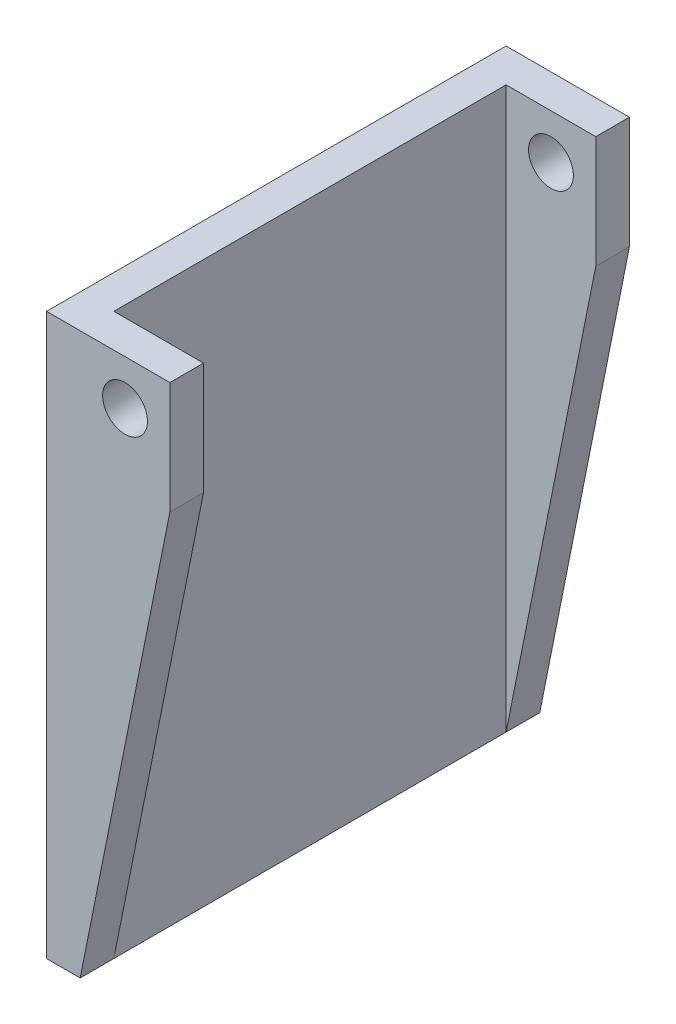
ISO-10303-21;
HEADER;
FILE_DESCRIPTION(('STEP AP214'),'2;1');
FILE_NAME('part.step','',(''),(''),'','','');
FILE_SCHEMA(('AUTOMOTIVE_DESIGN { 1 0 10303 214 1 1 1 1 }'));
ENDSEC;
DATA;
#1=APPLICATION_CONTEXT('core data for automotive mechanical design processes');
#2=APPLICATION_PROTOCOL_DEFINITION('international standard','automotive_design',2000,#1);
#3=PRODUCT_CONTEXT('',#1,'mechanical');
#4=PRODUCT('Part','Part','',(#3));
#5=PRODUCT_RELATED_PRODUCT_CATEGORY('part','',(#4));
#6=PRODUCT_DEFINITION_FORMATION('','',#4);
#7=PRODUCT_DEFINITION_CONTEXT('part definition',#1,'design');
#8=PRODUCT_DEFINITION('design','',#6,#7);
#9=PRODUCT_DEFINITION_SHAPE('','',#8);
#10=(LENGTH_UNIT() NAMED_UNIT(*) SI_UNIT(.MILLI.,.METRE.));
#11=(NAMED_UNIT(*) PLANE_ANGLE_UNIT() SI_UNIT($,.RADIAN.));
#12=(NAMED_UNIT(*) SI_UNIT($,.STERADIAN.) SOLID_ANGLE_UNIT());
#13=UNCERTAINTY_MEASURE_WITH_UNIT(LENGTH_MEASURE(1.E-05),#10,'distance_accuracy_value','');
#14=(GEOMETRIC_REPRESENTATION_CONTEXT(3) GLOBAL_UNCERTAINTY_ASSIGNED_CONTEXT((#13)) GLOBAL_UNIT_ASSIGNED_CONTEXT((#10,
#11,#12)) REPRESENTATION_CONTEXT('',''));
#15=CARTESIAN_POINT('',(0.,0.,0.));
#16=DIRECTION('',(0.,0.,1.));
#17=DIRECTION('',(1.,0.,0.));
#18=AXIS2_PLACEMENT_3D('',#15,#16,#17);
#19=CARTESIAN_POINT('',(3.,0.,0.));
#20=DIRECTION('',(1.,0.,0.));
#21=DIRECTION('',(0.,0.,-1.));
#22=AXIS2_PLACEMENT_3D('',#19,#20,#21);
#23=PLANE('',#22);
#24=DIRECTION('',(0.,0.,-1.));
#25=VECTOR('',#24,1.);
#26=CARTESIAN_POINT('',(3.,-25.,20.4954954954955));
#27=LINE('',#26,#25);
#28=CARTESIAN_POINT('',(3.,-25.,17.4954954954955));
#29=VERTEX_POINT('',#28);
#30=CARTESIAN_POINT('',(3.,-25.,-17.4954954954955));
#31=VERTEX_POINT('',#30);
#32=EDGE_CURVE('E169',#29,#31,#27,.T.);
#33=ORIENTED_EDGE('',*,*,#32,.T.);
#34=DIRECTION('',(0.,-1.,0.));
#35=VECTOR('',#34,1.);
#36=CARTESIAN_POINT('',(3.,25.,-17.4954954954955));
#37=LINE('',#36,#35);
#38=CARTESIAN_POINT('',(3.,25.,-17.4954954954955));
#39=VERTEX_POINT('',#38);
#40=EDGE_CURVE('E48',#39,#31,#37,.T.);
#41=ORIENTED_EDGE('',*,*,#40,.F.);
#42=DIRECTION('',(0.,0.,1.));
#43=VECTOR('',#42,1.);
#44=CARTESIAN_POINT('',(3.,25.,20.4954954954955));
#45=LINE('',#44,#43);
#46=CARTESIAN_POINT('',(3.,25.,17.4954954954955));
#47=VERTEX_POINT('',#46);
#48=EDGE_CURVE('E127',#39,#47,#45,.T.);
#49=ORIENTED_EDGE('',*,*,#48,.T.);
#50=DIRECTION('',(0.,-1.,0.));
#51=VECTOR('',#50,1.);
#52=CARTESIAN_POINT('',(3.,25.,17.4954954954955));
#53=LINE('',#52,#51);
#54=EDGE_CURVE('E146',#47,#29,#53,.T.);
#55=ORIENTED_EDGE('',*,*,#54,.T.);
#56=EDGE_LOOP('',(#33,#41,#49,#55));
#57=FACE_BOUND('',#56,.T.);
#58=ADVANCED_FACE('F33',(#57),#23,.T.);
#59=CARTESIAN_POINT('',(3.,25.,-20.4954954954955));
#60=DIRECTION('',(0.,0.,1.));
#61=DIRECTION('',(1.,0.,0.));
#62=AXIS2_PLACEMENT_3D('',#59,#60,#61);
#63=PLANE('',#62);
#64=CARTESIAN_POINT('',(7.,21.,-20.4954954954955));
#65=DIRECTION('',(0.,0.,1.));
#66=DIRECTION('',(1.,0.,0.));
#67=AXIS2_PLACEMENT_3D('',#64,#65,#66);
#68=CIRCLE('',#67,2.);
#69=CARTESIAN_POINT('',(9.,21.,-20.4954954954955));
#70=VERTEX_POINT('',#69);
#71=EDGE_CURVE('E325',#70,#70,#68,.T.);
#72=ORIENTED_EDGE('',*,*,#71,.T.);
#73=EDGE_LOOP('',(#72));
#74=FACE_BOUND('',#73,.T.);
#75=DIRECTION('',(0.,1.,0.));
#76=VECTOR('',#75,1.);
#77=CARTESIAN_POINT('',(0.,25.,-20.4954954954955));
#78=LINE('',#77,#76);
#79=CARTESIAN_POINT('',(0.,-25.,-20.4954954954955));
#80=VERTEX_POINT('',#79);
#81=CARTESIAN_POINT('',(0.,25.,-20.4954954954955));
#82=VERTEX_POINT('',#81);
#83=EDGE_CURVE('E166',#80,#82,#78,.T.);
#84=ORIENTED_EDGE('',*,*,#83,.T.);
#85=DIRECTION('',(-1.,0.,0.));
#86=VECTOR('',#85,1.);
#87=CARTESIAN_POINT('',(3.,25.,-20.4954954954955));
#88=LINE('',#87,#86);
#89=CARTESIAN_POINT('',(11.,25.,-20.4954954954955));
#90=VERTEX_POINT('',#89);
#91=EDGE_CURVE('E11',#90,#82,#88,.T.);
#92=ORIENTED_EDGE('',*,*,#91,.F.);
#93=DIRECTION('',(0.,1.,0.));
#94=VECTOR('',#93,1.);
#95=CARTESIAN_POINT('',(11.,25.,-20.4954954954955));
#96=LINE('',#95,#94);
#97=CARTESIAN_POINT('',(11.,15.,-20.4954954954955));
#98=VERTEX_POINT('',#97);
#99=EDGE_CURVE('E121',#98,#90,#96,.T.);
#100=ORIENTED_EDGE('',*,*,#99,.F.);
#101=DIRECTION('',(0.196116135138184,0.98058067569092,0.));
#102=VECTOR('',#101,1.);
#103=CARTESIAN_POINT('',(11.,15.,-20.4954954954955));
#104=LINE('',#103,#102);
#105=CARTESIAN_POINT('',(3.,-25.,-20.4954954954955));
#106=VERTEX_POINT('',#105);
#107=EDGE_CURVE('E129',#106,#98,#104,.T.);
#108=ORIENTED_EDGE('',*,*,#107,.F.);
#109=DIRECTION('',(-1.,0.,0.));
#110=VECTOR('',#109,1.);
#111=CARTESIAN_POINT('',(3.,-25.,-20.4954954954955));
#112=LINE('',#111,#110);
#113=EDGE_CURVE('E174',#106,#80,#112,.T.);
#114=ORIENTED_EDGE('',*,*,#113,.T.);
#115=EDGE_LOOP('',(#84,#92,#100,#108,#114));
#116=FACE_BOUND('',#115,.T.);
#117=ADVANCED_FACE('F35',(#74,#116),#63,.F.);
#118=CARTESIAN_POINT('',(3.,25.,20.4954954954955));
#119=DIRECTION('',(0.,-1.,0.));
#120=DIRECTION('',(0.,0.,-1.));
#121=AXIS2_PLACEMENT_3D('',#118,#119,#120);
#122=PLANE('',#121);
#123=DIRECTION('',(0.,0.,1.));
#124=VECTOR('',#123,1.);
#125=CARTESIAN_POINT('',(0.,25.,20.4954954954955));
#126=LINE('',#125,#124);
#127=CARTESIAN_POINT('',(0.,25.,20.4954954954955));
#128=VERTEX_POINT('',#127);
#129=EDGE_CURVE('E177',#82,#128,#126,.T.);
#130=ORIENTED_EDGE('',*,*,#129,.T.);
#131=DIRECTION('',(-1.,0.,0.));
#132=VECTOR('',#131,1.);
#133=CARTESIAN_POINT('',(3.,25.,20.4954954954955));
#134=LINE('',#133,#132);
#135=CARTESIAN_POINT('',(11.,25.,20.4954954954955));
#136=VERTEX_POINT('',#135);
#137=EDGE_CURVE('E41',#136,#128,#134,.T.);
#138=ORIENTED_EDGE('',*,*,#137,.F.);
#139=DIRECTION('',(0.,0.,1.));
#140=VECTOR('',#139,1.);
#141=CARTESIAN_POINT('',(11.,25.,17.4954954954955));
#142=LINE('',#141,#140);
#143=CARTESIAN_POINT('',(11.,25.,17.4954954954955));
#144=VERTEX_POINT('',#143);
#145=EDGE_CURVE('E163',#144,#136,#142,.T.);
#146=ORIENTED_EDGE('',*,*,#145,.F.);
#147=DIRECTION('',(-1.,0.,0.));
#148=VECTOR('',#147,1.);
#149=CARTESIAN_POINT('',(3.,25.,17.4954954954955));
#150=LINE('',#149,#148);
#151=EDGE_CURVE('E156',#144,#47,#150,.T.);
#152=ORIENTED_EDGE('',*,*,#151,.T.);
#153=ORIENTED_EDGE('',*,*,#48,.F.);
#154=DIRECTION('',(-1.,0.,0.));
#155=VECTOR('',#154,1.);
#156=CARTESIAN_POINT('',(3.,25.,-17.4954954954955));
#157=LINE('',#156,#155);
#158=CARTESIAN_POINT('',(11.,25.,-17.4954954954955));
#159=VERTEX_POINT('',#158);
#160=EDGE_CURVE('E109',#159,#39,#157,.T.);
#161=ORIENTED_EDGE('',*,*,#160,.F.);
#162=DIRECTION('',(0.,0.,-1.));
#163=VECTOR('',#162,1.);
#164=CARTESIAN_POINT('',(11.,25.,-17.4954954954955));
#165=LINE('',#164,#163);
#166=EDGE_CURVE('E118',#159,#90,#165,.T.);
#167=ORIENTED_EDGE('',*,*,#166,.T.);
#168=ORIENTED_EDGE('',*,*,#91,.T.);
#169=EDGE_LOOP('',(#130,#138,#146,#152,#153,#161,#167,#168));
#170=FACE_BOUND('',#169,.T.);
#171=ADVANCED_FACE('F125',(#170),#122,.F.);
#172=CARTESIAN_POINT('',(3.,25.,20.4954954954955));
#173=DIRECTION('',(0.,0.,-1.));
#174=DIRECTION('',(-1.,0.,0.));
#175=AXIS2_PLACEMENT_3D('',#172,#173,#174);
#176=PLANE('',#175);
#177=CARTESIAN_POINT('',(7.,21.,20.4954954954955));
#178=DIRECTION('',(0.,0.,1.));
#179=DIRECTION('',(1.,0.,0.));
#180=AXIS2_PLACEMENT_3D('',#177,#178,#179);
#181=CIRCLE('',#180,2.);
#182=CARTESIAN_POINT('',(9.,21.,20.4954954954955));
#183=VERTEX_POINT('',#182);
#184=EDGE_CURVE('E138',#183,#183,#181,.T.);
#185=ORIENTED_EDGE('',*,*,#184,.F.);
#186=EDGE_LOOP('',(#185));
#187=FACE_BOUND('',#186,.T.);
#188=DIRECTION('',(0.,-1.,0.));
#189=VECTOR('',#188,1.);
#190=CARTESIAN_POINT('',(0.,25.,20.4954954954955));
#191=LINE('',#190,#189);
#192=CARTESIAN_POINT('',(0.,-25.,20.4954954954955));
#193=VERTEX_POINT('',#192);
#194=EDGE_CURVE('E179',#128,#193,#191,.T.);
#195=ORIENTED_EDGE('',*,*,#194,.T.);
#196=DIRECTION('',(-1.,0.,0.));
#197=VECTOR('',#196,1.);
#198=CARTESIAN_POINT('',(3.,-25.,20.4954954954955));
#199=LINE('',#198,#197);
#200=CARTESIAN_POINT('',(3.,-25.,20.4954954954955));
#201=VERTEX_POINT('',#200);
#202=EDGE_CURVE('E184',#201,#193,#199,.T.);
#203=ORIENTED_EDGE('',*,*,#202,.F.);
#204=DIRECTION('',(0.196116135138184,0.98058067569092,0.));
#205=VECTOR('',#204,1.);
#206=CARTESIAN_POINT('',(11.,15.,20.4954954954955));
#207=LINE('',#206,#205);
#208=CARTESIAN_POINT('',(11.,15.,20.4954954954955));
#209=VERTEX_POINT('',#208);
#210=EDGE_CURVE('E143',#201,#209,#207,.T.);
#211=ORIENTED_EDGE('',*,*,#210,.T.);
#212=DIRECTION('',(0.,1.,0.));
#213=VECTOR('',#212,1.);
#214=CARTESIAN_POINT('',(11.,25.,20.4954954954955));
#215=LINE('',#214,#213);
#216=EDGE_CURVE('E150',#209,#136,#215,.T.);
#217=ORIENTED_EDGE('',*,*,#216,.T.);
#218=ORIENTED_EDGE('',*,*,#137,.T.);
#219=EDGE_LOOP('',(#195,#203,#211,#217,#218));
#220=FACE_BOUND('',#219,.T.);
#221=ADVANCED_FACE('F189',(#187,#220),#176,.F.);
#222=CARTESIAN_POINT('',(3.,-25.,20.4954954954955));
#223=DIRECTION('',(0.,1.,0.));
#224=DIRECTION('',(0.,0.,1.));
#225=AXIS2_PLACEMENT_3D('',#222,#223,#224);
#226=PLANE('',#225);
#227=DIRECTION('',(0.,0.,-1.));
#228=VECTOR('',#227,1.);
#229=CARTESIAN_POINT('',(0.,-25.,20.4954954954955));
#230=LINE('',#229,#228);
#231=EDGE_CURVE('E170',#193,#80,#230,.T.);
#232=ORIENTED_EDGE('',*,*,#231,.T.);
#233=ORIENTED_EDGE('',*,*,#113,.F.);
#234=DIRECTION('',(0.,0.,-1.));
#235=VECTOR('',#234,1.);
#236=CARTESIAN_POINT('',(3.,-25.,-17.4954954954955));
#237=LINE('',#236,#235);
#238=EDGE_CURVE('E56',#31,#106,#237,.T.);
#239=ORIENTED_EDGE('',*,*,#238,.F.);
#240=ORIENTED_EDGE('',*,*,#32,.F.);
#241=EDGE_CURVE('E171',#201,#29,#27,.T.);
#242=ORIENTED_EDGE('',*,*,#241,.F.);
#243=ORIENTED_EDGE('',*,*,#202,.T.);
#244=EDGE_LOOP('',(#232,#233,#239,#240,#242,#243));
#245=FACE_BOUND('',#244,.T.);
#246=ADVANCED_FACE('F196',(#245),#226,.F.);
#247=CARTESIAN_POINT('',(0.,0.,0.));
#248=DIRECTION('',(1.,0.,0.));
#249=DIRECTION('',(0.,0.,-1.));
#250=AXIS2_PLACEMENT_3D('',#247,#248,#249);
#251=PLANE('',#250);
#252=ORIENTED_EDGE('',*,*,#83,.F.);
#253=ORIENTED_EDGE('',*,*,#231,.F.);
#254=ORIENTED_EDGE('',*,*,#194,.F.);
#255=ORIENTED_EDGE('',*,*,#129,.F.);
#256=EDGE_LOOP('',(#252,#253,#254,#255));
#257=FACE_BOUND('',#256,.T.);
#258=ADVANCED_FACE('F195',(#257),#251,.F.);
#259=CARTESIAN_POINT('',(11.,25.,17.4954954954955));
#260=DIRECTION('',(1.,0.,0.));
#261=DIRECTION('',(0.,1.,0.));
#262=AXIS2_PLACEMENT_3D('',#259,#260,#261);
#263=PLANE('',#262);
#264=ORIENTED_EDGE('',*,*,#216,.F.);
#265=DIRECTION('',(0.,0.,1.));
#266=VECTOR('',#265,1.);
#267=CARTESIAN_POINT('',(11.,15.,17.4954954954955));
#268=LINE('',#267,#266);
#269=CARTESIAN_POINT('',(11.,15.,17.4954954954955));
#270=VERTEX_POINT('',#269);
#271=EDGE_CURVE('E158',#270,#209,#268,.T.);
#272=ORIENTED_EDGE('',*,*,#271,.F.);
#273=DIRECTION('',(0.,1.,0.));
#274=VECTOR('',#273,1.);
#275=CARTESIAN_POINT('',(11.,25.,17.4954954954955));
#276=LINE('',#275,#274);
#277=EDGE_CURVE('E153',#270,#144,#276,.T.);
#278=ORIENTED_EDGE('',*,*,#277,.T.);
#279=ORIENTED_EDGE('',*,*,#145,.T.);
#280=EDGE_LOOP('',(#264,#272,#278,#279));
#281=FACE_BOUND('',#280,.T.);
#282=ADVANCED_FACE('F226',(#281),#263,.T.);
#283=CARTESIAN_POINT('',(11.,15.,17.4954954954955));
#284=DIRECTION('',(0.98058067569092,-0.196116135138184,0.));
#285=DIRECTION('',(0.196116135138184,0.98058067569092,0.));
#286=AXIS2_PLACEMENT_3D('',#283,#284,#285);
#287=PLANE('',#286);
#288=ORIENTED_EDGE('',*,*,#210,.F.);
#289=ORIENTED_EDGE('',*,*,#241,.T.);
#290=DIRECTION('',(0.196116135138184,0.98058067569092,0.));
#291=VECTOR('',#290,1.);
#292=CARTESIAN_POINT('',(11.,15.,17.4954954954955));
#293=LINE('',#292,#291);
#294=EDGE_CURVE('E149',#29,#270,#293,.T.);
#295=ORIENTED_EDGE('',*,*,#294,.T.);
#296=ORIENTED_EDGE('',*,*,#271,.T.);
#297=EDGE_LOOP('',(#288,#289,#295,#296));
#298=FACE_BOUND('',#297,.T.);
#299=ADVANCED_FACE('F222',(#298),#287,.T.);
#300=CARTESIAN_POINT('',(0.,0.,17.4954954954955));
#301=DIRECTION('',(0.,0.,1.));
#302=DIRECTION('',(1.,0.,0.));
#303=AXIS2_PLACEMENT_3D('',#300,#301,#302);
#304=PLANE('',#303);
#305=CARTESIAN_POINT('',(7.,21.,17.4954954954955));
#306=DIRECTION('',(0.,0.,1.));
#307=DIRECTION('',(1.,0.,0.));
#308=AXIS2_PLACEMENT_3D('',#305,#306,#307);
#309=CIRCLE('',#308,2.);
#310=CARTESIAN_POINT('',(9.,21.,17.4954954954955));
#311=VERTEX_POINT('',#310);
#312=EDGE_CURVE('E140',#311,#311,#309,.T.);
#313=ORIENTED_EDGE('',*,*,#312,.T.);
#314=EDGE_LOOP('',(#313));
#315=FACE_BOUND('',#314,.T.);
#316=ORIENTED_EDGE('',*,*,#54,.F.);
#317=ORIENTED_EDGE('',*,*,#151,.F.);
#318=ORIENTED_EDGE('',*,*,#277,.F.);
#319=ORIENTED_EDGE('',*,*,#294,.F.);
#320=EDGE_LOOP('',(#316,#317,#318,#319));
#321=FACE_BOUND('',#320,.T.);
#322=ADVANCED_FACE('F210',(#315,#321),#304,.F.);
#323=CARTESIAN_POINT('',(7.,21.,17.4954954954955));
#324=DIRECTION('',(0.,0.,1.));
#325=DIRECTION('',(1.,0.,0.));
#326=AXIS2_PLACEMENT_3D('',#323,#324,#325);
#327=CYLINDRICAL_SURFACE('',#326,2.);
#328=ORIENTED_EDGE('',*,*,#312,.F.);
#329=EDGE_LOOP('',(#328));
#330=FACE_BOUND('',#329,.T.);
#331=ORIENTED_EDGE('',*,*,#184,.T.);
#332=EDGE_LOOP('',(#331));
#333=FACE_BOUND('',#332,.T.);
#334=ADVANCED_FACE('F203',(#330,#333),#327,.F.);
#335=CARTESIAN_POINT('',(11.,15.,-17.4954954954955));
#336=DIRECTION('',(-0.98058067569092,0.196116135138184,0.));
#337=DIRECTION('',(-0.196116135138184,-0.98058067569092,0.));
#338=AXIS2_PLACEMENT_3D('',#335,#336,#337);
#339=PLANE('',#338);
#340=ORIENTED_EDGE('',*,*,#107,.T.);
#341=DIRECTION('',(0.,0.,-1.));
#342=VECTOR('',#341,1.);
#343=CARTESIAN_POINT('',(11.,15.,-17.4954954954955));
#344=LINE('',#343,#342);
#345=CARTESIAN_POINT('',(11.,15.,-17.4954954954955));
#346=VERTEX_POINT('',#345);
#347=EDGE_CURVE('E123',#346,#98,#344,.T.);
#348=ORIENTED_EDGE('',*,*,#347,.F.);
#349=DIRECTION('',(0.196116135138184,0.98058067569092,0.));
#350=VECTOR('',#349,1.);
#351=CARTESIAN_POINT('',(11.,15.,-17.4954954954955));
#352=LINE('',#351,#350);
#353=EDGE_CURVE('E111',#31,#346,#352,.T.);
#354=ORIENTED_EDGE('',*,*,#353,.F.);
#355=ORIENTED_EDGE('',*,*,#238,.T.);
#356=EDGE_LOOP('',(#340,#348,#354,#355));
#357=FACE_BOUND('',#356,.T.);
#358=ADVANCED_FACE('F201',(#357),#339,.F.);
#359=CARTESIAN_POINT('',(11.,25.,-17.4954954954955));
#360=DIRECTION('',(-1.,0.,0.));
#361=DIRECTION('',(0.,-1.,0.));
#362=AXIS2_PLACEMENT_3D('',#359,#360,#361);
#363=PLANE('',#362);
#364=ORIENTED_EDGE('',*,*,#99,.T.);
#365=ORIENTED_EDGE('',*,*,#166,.F.);
#366=DIRECTION('',(0.,1.,0.));
#367=VECTOR('',#366,1.);
#368=CARTESIAN_POINT('',(11.,25.,-17.4954954954955));
#369=LINE('',#368,#367);
#370=EDGE_CURVE('E105',#346,#159,#369,.T.);
#371=ORIENTED_EDGE('',*,*,#370,.F.);
#372=ORIENTED_EDGE('',*,*,#347,.T.);
#373=EDGE_LOOP('',(#364,#365,#371,#372));
#374=FACE_BOUND('',#373,.T.);
#375=ADVANCED_FACE('F119',(#374),#363,.F.);
#376=CARTESIAN_POINT('',(0.,0.,-17.4954954954955));
#377=DIRECTION('',(0.,0.,-1.));
#378=DIRECTION('',(1.,0.,0.));
#379=AXIS2_PLACEMENT_3D('',#376,#377,#378);
#380=PLANE('',#379);
#381=CARTESIAN_POINT('',(7.,21.,-17.4954954954955));
#382=DIRECTION('',(0.,0.,1.));
#383=DIRECTION('',(1.,0.,0.));
#384=AXIS2_PLACEMENT_3D('',#381,#382,#383);
#385=CIRCLE('',#384,2.);
#386=CARTESIAN_POINT('',(9.,21.,-17.4954954954955));
#387=VERTEX_POINT('',#386);
#388=EDGE_CURVE('E135',#387,#387,#385,.T.);
#389=ORIENTED_EDGE('',*,*,#388,.F.);
#390=EDGE_LOOP('',(#389));
#391=FACE_BOUND('',#390,.T.);
#392=ORIENTED_EDGE('',*,*,#40,.T.);
#393=ORIENTED_EDGE('',*,*,#353,.T.);
#394=ORIENTED_EDGE('',*,*,#370,.T.);
#395=ORIENTED_EDGE('',*,*,#160,.T.);
#396=EDGE_LOOP('',(#392,#393,#394,#395));
#397=FACE_BOUND('',#396,.T.);
#398=ADVANCED_FACE('F107',(#391,#397),#380,.F.);
#399=CARTESIAN_POINT('',(7.,21.,-17.4954954954955));
#400=DIRECTION('',(0.,0.,-1.));
#401=DIRECTION('',(-1.,0.,0.));
#402=AXIS2_PLACEMENT_3D('',#399,#400,#401);
#403=CYLINDRICAL_SURFACE('',#402,2.);
#404=ORIENTED_EDGE('',*,*,#388,.T.);
#405=EDGE_LOOP('',(#404));
#406=FACE_BOUND('',#405,.T.);
#407=ORIENTED_EDGE('',*,*,#71,.F.);
#408=EDGE_LOOP('',(#407));
#409=FACE_BOUND('',#408,.T.);
#410=ADVANCED_FACE('F307',(#406,#409),#403,.F.);
#411=CLOSED_SHELL('',(#58,#117,#171,#221,#246,#258,#282,#299,#322,#334,#358,#375,#398,#410));
#412=MANIFOLD_SOLID_BREP('B2',#411);
#413=ADVANCED_BREP_SHAPE_REPRESENTATION('',(#18,#412),#14);
#414=SHAPE_DEFINITION_REPRESENTATION(#9,#413);
ENDSEC;
END-ISO-10303-21;
